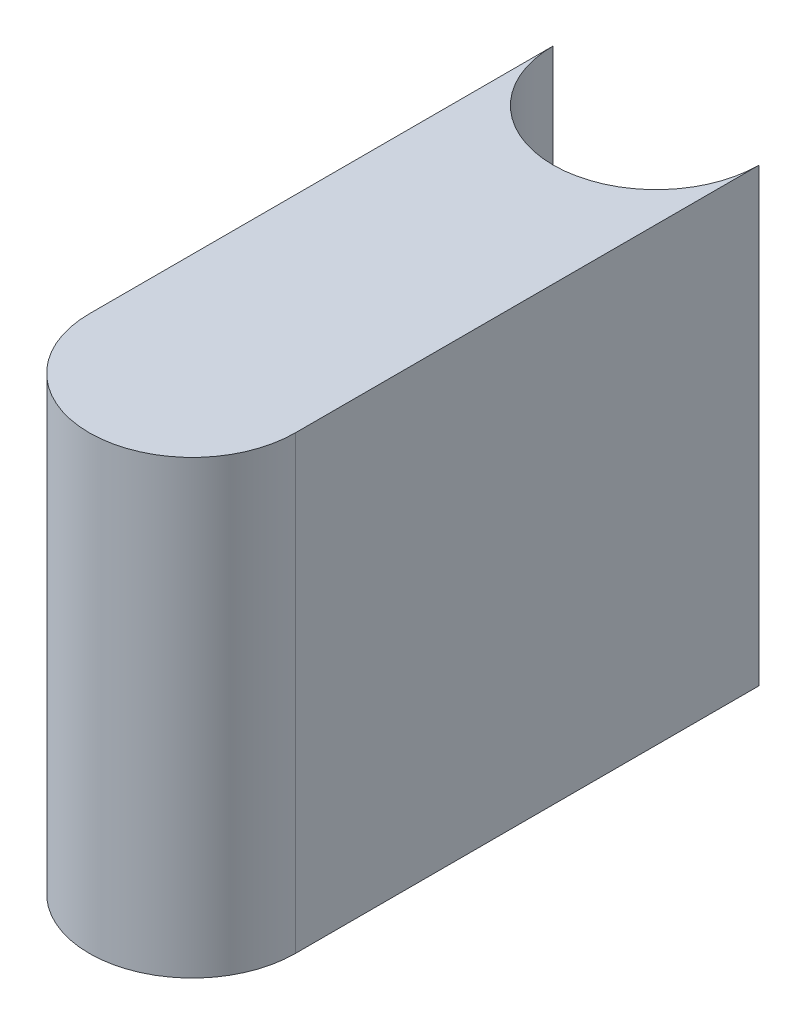
ISO-10303-21;
HEADER;
FILE_DESCRIPTION(('STEP AP214'),'2;1');
FILE_NAME('part.step','',(''),(''),'','','');
FILE_SCHEMA(('AUTOMOTIVE_DESIGN { 1 0 10303 214 1 1 1 1 }'));
ENDSEC;
DATA;
#1=APPLICATION_CONTEXT('core data for automotive mechanical design processes');
#2=APPLICATION_PROTOCOL_DEFINITION('international standard','automotive_design',2000,#1);
#3=PRODUCT_CONTEXT('',#1,'mechanical');
#4=PRODUCT('Part','Part','',(#3));
#5=PRODUCT_RELATED_PRODUCT_CATEGORY('part','',(#4));
#6=PRODUCT_DEFINITION_FORMATION('','',#4);
#7=PRODUCT_DEFINITION_CONTEXT('part definition',#1,'design');
#8=PRODUCT_DEFINITION('design','',#6,#7);
#9=PRODUCT_DEFINITION_SHAPE('','',#8);
#10=(LENGTH_UNIT() NAMED_UNIT(*) SI_UNIT(.MILLI.,.METRE.));
#11=(NAMED_UNIT(*) PLANE_ANGLE_UNIT() SI_UNIT($,.RADIAN.));
#12=(NAMED_UNIT(*) SI_UNIT($,.STERADIAN.) SOLID_ANGLE_UNIT());
#13=UNCERTAINTY_MEASURE_WITH_UNIT(LENGTH_MEASURE(1.E-05),#10,'distance_accuracy_value','');
#14=(GEOMETRIC_REPRESENTATION_CONTEXT(3) GLOBAL_UNCERTAINTY_ASSIGNED_CONTEXT((#13)) GLOBAL_UNIT_ASSIGNED_CONTEXT((#10,
#11,#12)) REPRESENTATION_CONTEXT('',''));
#15=CARTESIAN_POINT('',(0.,0.,0.));
#16=DIRECTION('',(0.,0.,1.));
#17=DIRECTION('',(1.,0.,0.));
#18=AXIS2_PLACEMENT_3D('',#15,#16,#17);
#19=CARTESIAN_POINT('',(-10.3414065632232,350.,-354.111123330667));
#20=DIRECTION('',(0.,-1.,0.));
#21=DIRECTION('',(0.,0.,-1.));
#22=AXIS2_PLACEMENT_3D('',#19,#20,#21);
#23=CYLINDRICAL_SURFACE('',#22,80.);
#24=CARTESIAN_POINT('',(-10.3414065632232,0.,-354.111123330667));
#25=DIRECTION('',(0.,-1.,0.));
#26=DIRECTION('',(0.,0.,1.));
#27=AXIS2_PLACEMENT_3D('',#24,#25,#26);
#28=CIRCLE('',#27,80.);
#29=CARTESIAN_POINT('',(69.6585934367768,0.,-354.111123330667));
#30=VERTEX_POINT('',#29);
#31=CARTESIAN_POINT('',(-90.3414065632232,0.,-354.111123330667));
#32=VERTEX_POINT('',#31);
#33=EDGE_CURVE('E96',#30,#32,#28,.T.);
#34=ORIENTED_EDGE('',*,*,#33,.T.);
#35=DIRECTION('',(0.,-1.,0.));
#36=VECTOR('',#35,1.);
#37=CARTESIAN_POINT('',(-90.3414065632232,350.,-354.111123330667));
#38=LINE('',#37,#36);
#39=CARTESIAN_POINT('',(-90.3414065632232,350.,-354.111123330667));
#40=VERTEX_POINT('',#39);
#41=EDGE_CURVE('E11',#40,#32,#38,.T.);
#42=ORIENTED_EDGE('',*,*,#41,.F.);
#43=CARTESIAN_POINT('',(-10.3414065632232,350.,-354.111123330667));
#44=DIRECTION('',(0.,-1.,0.));
#45=DIRECTION('',(0.,0.,1.));
#46=AXIS2_PLACEMENT_3D('',#43,#44,#45);
#47=CIRCLE('',#46,80.);
#48=CARTESIAN_POINT('',(69.6585934367768,350.,-354.111123330667));
#49=VERTEX_POINT('',#48);
#50=EDGE_CURVE('E84',#49,#40,#47,.T.);
#51=ORIENTED_EDGE('',*,*,#50,.F.);
#52=DIRECTION('',(0.,-1.,0.));
#53=VECTOR('',#52,1.);
#54=CARTESIAN_POINT('',(69.6585934367768,350.,-354.111123330667));
#55=LINE('',#54,#53);
#56=EDGE_CURVE('E92',#49,#30,#55,.T.);
#57=ORIENTED_EDGE('',*,*,#56,.T.);
#58=EDGE_LOOP('',(#34,#42,#51,#57));
#59=FACE_BOUND('',#58,.T.);
#60=ADVANCED_FACE('F33',(#59),#23,.F.);
#61=CARTESIAN_POINT('',(-90.3414065632232,350.,-354.111123330667));
#62=DIRECTION('',(1.,0.,0.));
#63=DIRECTION('',(0.,0.,-1.));
#64=AXIS2_PLACEMENT_3D('',#61,#62,#63);
#65=PLANE('',#64);
#66=DIRECTION('',(0.,0.,1.));
#67=VECTOR('',#66,1.);
#68=CARTESIAN_POINT('',(-90.3414065632232,0.,-354.111123330667));
#69=LINE('',#68,#67);
#70=CARTESIAN_POINT('',(-90.3414065632232,0.,5.88887666933346));
#71=VERTEX_POINT('',#70);
#72=EDGE_CURVE('E88',#32,#71,#69,.T.);
#73=ORIENTED_EDGE('',*,*,#72,.T.);
#74=DIRECTION('',(0.,-1.,0.));
#75=VECTOR('',#74,1.);
#76=CARTESIAN_POINT('',(-90.3414065632232,350.,5.88887666933346));
#77=LINE('',#76,#75);
#78=CARTESIAN_POINT('',(-90.3414065632232,350.,5.88887666933346));
#79=VERTEX_POINT('',#78);
#80=EDGE_CURVE('E41',#79,#71,#77,.T.);
#81=ORIENTED_EDGE('',*,*,#80,.F.);
#82=DIRECTION('',(0.,0.,1.));
#83=VECTOR('',#82,1.);
#84=CARTESIAN_POINT('',(-90.3414065632232,350.,-354.111123330667));
#85=LINE('',#84,#83);
#86=EDGE_CURVE('E79',#40,#79,#85,.T.);
#87=ORIENTED_EDGE('',*,*,#86,.F.);
#88=ORIENTED_EDGE('',*,*,#41,.T.);
#89=EDGE_LOOP('',(#73,#81,#87,#88));
#90=FACE_BOUND('',#89,.T.);
#91=ADVANCED_FACE('F87',(#90),#65,.F.);
#92=CARTESIAN_POINT('',(-10.3414065632232,350.,5.88887666933346));
#93=DIRECTION('',(0.,-1.,0.));
#94=DIRECTION('',(0.,0.,-1.));
#95=AXIS2_PLACEMENT_3D('',#92,#93,#94);
#96=CYLINDRICAL_SURFACE('',#95,80.);
#97=CARTESIAN_POINT('',(-10.3414065632232,0.,5.88887666933346));
#98=DIRECTION('',(0.,1.,0.));
#99=DIRECTION('',(0.,0.,1.));
#100=AXIS2_PLACEMENT_3D('',#97,#98,#99);
#101=CIRCLE('',#100,80.);
#102=CARTESIAN_POINT('',(69.6585934367768,0.,5.88887666933347));
#103=VERTEX_POINT('',#102);
#104=EDGE_CURVE('E66',#71,#103,#101,.T.);
#105=ORIENTED_EDGE('',*,*,#104,.T.);
#106=DIRECTION('',(0.,-1.,0.));
#107=VECTOR('',#106,1.);
#108=CARTESIAN_POINT('',(69.6585934367768,350.,5.88887666933347));
#109=LINE('',#108,#107);
#110=CARTESIAN_POINT('',(69.6585934367768,350.,5.88887666933347));
#111=VERTEX_POINT('',#110);
#112=EDGE_CURVE('E89',#111,#103,#109,.T.);
#113=ORIENTED_EDGE('',*,*,#112,.F.);
#114=CARTESIAN_POINT('',(-10.3414065632232,350.,5.88887666933346));
#115=DIRECTION('',(0.,1.,0.));
#116=DIRECTION('',(0.,0.,1.));
#117=AXIS2_PLACEMENT_3D('',#114,#115,#116);
#118=CIRCLE('',#117,80.);
#119=EDGE_CURVE('E82',#79,#111,#118,.T.);
#120=ORIENTED_EDGE('',*,*,#119,.F.);
#121=ORIENTED_EDGE('',*,*,#80,.T.);
#122=EDGE_LOOP('',(#105,#113,#120,#121));
#123=FACE_BOUND('',#122,.T.);
#124=ADVANCED_FACE('F90',(#123),#96,.T.);
#125=CARTESIAN_POINT('',(69.6585934367768,350.,-354.111123330667));
#126=DIRECTION('',(-1.,0.,0.));
#127=DIRECTION('',(0.,0.,1.));
#128=AXIS2_PLACEMENT_3D('',#125,#126,#127);
#129=PLANE('',#128);
#130=DIRECTION('',(0.,0.,-1.));
#131=VECTOR('',#130,1.);
#132=CARTESIAN_POINT('',(69.6585934367768,0.,-354.111123330667));
#133=LINE('',#132,#131);
#134=EDGE_CURVE('E72',#103,#30,#133,.T.);
#135=ORIENTED_EDGE('',*,*,#134,.T.);
#136=ORIENTED_EDGE('',*,*,#56,.F.);
#137=DIRECTION('',(0.,0.,-1.));
#138=VECTOR('',#137,1.);
#139=CARTESIAN_POINT('',(69.6585934367768,350.,-354.111123330667));
#140=LINE('',#139,#138);
#141=EDGE_CURVE('E49',#111,#49,#140,.T.);
#142=ORIENTED_EDGE('',*,*,#141,.F.);
#143=ORIENTED_EDGE('',*,*,#112,.T.);
#144=EDGE_LOOP('',(#135,#136,#142,#143));
#145=FACE_BOUND('',#144,.T.);
#146=ADVANCED_FACE('F103',(#145),#129,.F.);
#147=CARTESIAN_POINT('',(-10.3414065632232,350.,-354.111123330667));
#148=DIRECTION('',(0.,1.,0.));
#149=DIRECTION('',(0.,0.,1.));
#150=AXIS2_PLACEMENT_3D('',#147,#148,#149);
#151=PLANE('',#150);
#152=ORIENTED_EDGE('',*,*,#50,.T.);
#153=ORIENTED_EDGE('',*,*,#86,.T.);
#154=ORIENTED_EDGE('',*,*,#119,.T.);
#155=ORIENTED_EDGE('',*,*,#141,.T.);
#156=EDGE_LOOP('',(#152,#153,#154,#155));
#157=FACE_BOUND('',#156,.T.);
#158=ADVANCED_FACE('F80',(#157),#151,.T.);
#159=CARTESIAN_POINT('',(-10.3414065632232,0.,-354.111123330667));
#160=DIRECTION('',(0.,1.,0.));
#161=DIRECTION('',(0.,0.,1.));
#162=AXIS2_PLACEMENT_3D('',#159,#160,#161);
#163=PLANE('',#162);
#164=ORIENTED_EDGE('',*,*,#33,.F.);
#165=ORIENTED_EDGE('',*,*,#134,.F.);
#166=ORIENTED_EDGE('',*,*,#104,.F.);
#167=ORIENTED_EDGE('',*,*,#72,.F.);
#168=EDGE_LOOP('',(#164,#165,#166,#167));
#169=FACE_BOUND('',#168,.T.);
#170=ADVANCED_FACE('F106',(#169),#163,.F.);
#171=CLOSED_SHELL('',(#60,#91,#124,#146,#158,#170));
#172=MANIFOLD_SOLID_BREP('B2',#171);
#173=ADVANCED_BREP_SHAPE_REPRESENTATION('',(#18,#172),#14);
#174=SHAPE_DEFINITION_REPRESENTATION(#9,#173);
ENDSEC;
END-ISO-10303-21;
